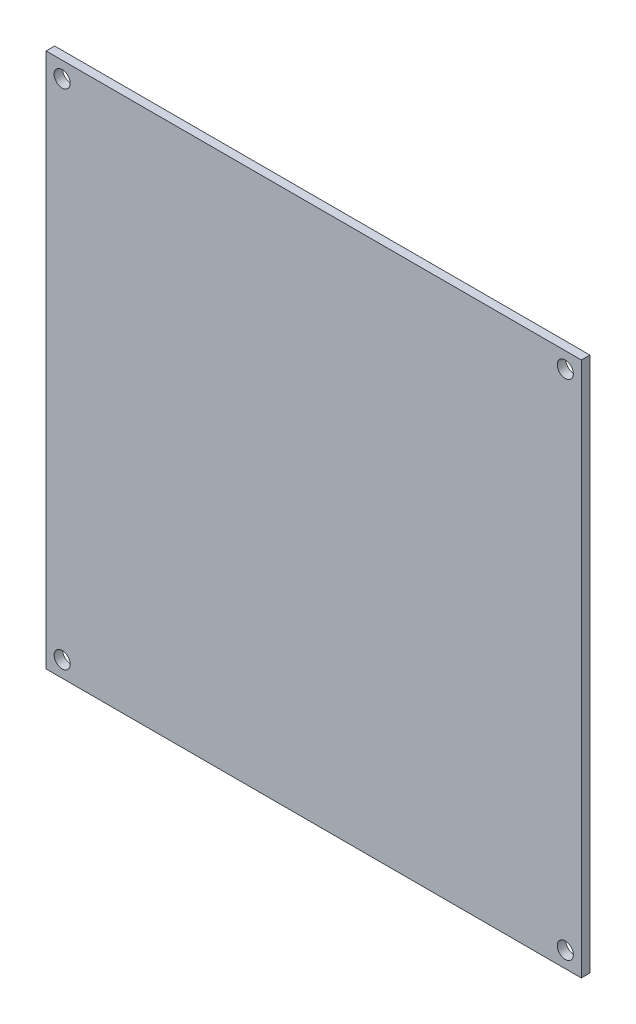
ISO-10303-21;
HEADER;
FILE_DESCRIPTION(('STEP AP214'),'2;1');
FILE_NAME('part.step','',(''),(''),'','','');
FILE_SCHEMA(('AUTOMOTIVE_DESIGN { 1 0 10303 214 1 1 1 1 }'));
ENDSEC;
DATA;
#1=APPLICATION_CONTEXT('core data for automotive mechanical design processes');
#2=APPLICATION_PROTOCOL_DEFINITION('international standard','automotive_design',2000,#1);
#3=PRODUCT_CONTEXT('',#1,'mechanical');
#4=PRODUCT('Part','Part','',(#3));
#5=PRODUCT_RELATED_PRODUCT_CATEGORY('part','',(#4));
#6=PRODUCT_DEFINITION_FORMATION('','',#4);
#7=PRODUCT_DEFINITION_CONTEXT('part definition',#1,'design');
#8=PRODUCT_DEFINITION('design','',#6,#7);
#9=PRODUCT_DEFINITION_SHAPE('','',#8);
#10=(LENGTH_UNIT() NAMED_UNIT(*) SI_UNIT(.MILLI.,.METRE.));
#11=(NAMED_UNIT(*) PLANE_ANGLE_UNIT() SI_UNIT($,.RADIAN.));
#12=(NAMED_UNIT(*) SI_UNIT($,.STERADIAN.) SOLID_ANGLE_UNIT());
#13=UNCERTAINTY_MEASURE_WITH_UNIT(LENGTH_MEASURE(1.E-05),#10,'distance_accuracy_value','');
#14=(GEOMETRIC_REPRESENTATION_CONTEXT(3) GLOBAL_UNCERTAINTY_ASSIGNED_CONTEXT((#13)) GLOBAL_UNIT_ASSIGNED_CONTEXT((#10,
#11,#12)) REPRESENTATION_CONTEXT('',''));
#15=CARTESIAN_POINT('',(0.,0.,0.));
#16=DIRECTION('',(0.,0.,1.));
#17=DIRECTION('',(1.,0.,0.));
#18=AXIS2_PLACEMENT_3D('',#15,#16,#17);
#19=CARTESIAN_POINT('',(0.,0.,1.6));
#20=DIRECTION('',(0.,0.,-1.));
#21=DIRECTION('',(-1.,0.,0.));
#22=AXIS2_PLACEMENT_3D('',#19,#20,#21);
#23=PLANE('',#22);
#24=DIRECTION('',(0.,-1.,0.));
#25=VECTOR('',#24,1.);
#26=CARTESIAN_POINT('',(0.,0.,1.6));
#27=LINE('',#26,#25);
#28=CARTESIAN_POINT('',(0.,100.,1.6));
#29=VERTEX_POINT('',#28);
#30=CARTESIAN_POINT('',(0.,0.,1.6));
#31=VERTEX_POINT('',#30);
#32=EDGE_CURVE('E92',#29,#31,#27,.T.);
#33=ORIENTED_EDGE('',*,*,#32,.T.);
#34=DIRECTION('',(1.,0.,0.));
#35=VECTOR('',#34,1.);
#36=CARTESIAN_POINT('',(0.,0.,1.6));
#37=LINE('',#36,#35);
#38=CARTESIAN_POINT('',(100.,0.,1.6));
#39=VERTEX_POINT('',#38);
#40=EDGE_CURVE('E87',#31,#39,#37,.T.);
#41=ORIENTED_EDGE('',*,*,#40,.T.);
#42=DIRECTION('',(0.,1.,0.));
#43=VECTOR('',#42,1.);
#44=CARTESIAN_POINT('',(100.,0.,1.6));
#45=LINE('',#44,#43);
#46=CARTESIAN_POINT('',(100.,100.,1.6));
#47=VERTEX_POINT('',#46);
#48=EDGE_CURVE('E90',#39,#47,#45,.T.);
#49=ORIENTED_EDGE('',*,*,#48,.T.);
#50=DIRECTION('',(-1.,0.,0.));
#51=VECTOR('',#50,1.);
#52=CARTESIAN_POINT('',(0.,100.,1.6));
#53=LINE('',#52,#51);
#54=EDGE_CURVE('E57',#47,#29,#53,.T.);
#55=ORIENTED_EDGE('',*,*,#54,.T.);
#56=EDGE_LOOP('',(#33,#41,#49,#55));
#57=FACE_BOUND('',#56,.T.);
#58=CARTESIAN_POINT('',(3.,3.,1.6));
#59=DIRECTION('',(0.,0.,1.));
#60=DIRECTION('',(1.,0.,0.));
#61=AXIS2_PLACEMENT_3D('',#58,#59,#60);
#62=CIRCLE('',#61,1.5);
#63=CARTESIAN_POINT('',(4.5,3.,1.6));
#64=VERTEX_POINT('',#63);
#65=EDGE_CURVE('E112',#64,#64,#62,.T.);
#66=ORIENTED_EDGE('',*,*,#65,.F.);
#67=EDGE_LOOP('',(#66));
#68=FACE_BOUND('',#67,.T.);
#69=CARTESIAN_POINT('',(97.,3.,1.6));
#70=DIRECTION('',(0.,0.,1.));
#71=DIRECTION('',(1.,0.,0.));
#72=AXIS2_PLACEMENT_3D('',#69,#70,#71);
#73=CIRCLE('',#72,1.5);
#74=CARTESIAN_POINT('',(98.5,3.,1.6));
#75=VERTEX_POINT('',#74);
#76=EDGE_CURVE('E134',#75,#75,#73,.T.);
#77=ORIENTED_EDGE('',*,*,#76,.F.);
#78=EDGE_LOOP('',(#77));
#79=FACE_BOUND('',#78,.T.);
#80=CARTESIAN_POINT('',(97.,97.,1.6));
#81=DIRECTION('',(0.,0.,1.));
#82=DIRECTION('',(1.,0.,0.));
#83=AXIS2_PLACEMENT_3D('',#80,#81,#82);
#84=CIRCLE('',#83,1.5);
#85=CARTESIAN_POINT('',(98.5,97.,1.6));
#86=VERTEX_POINT('',#85);
#87=EDGE_CURVE('E142',#86,#86,#84,.T.);
#88=ORIENTED_EDGE('',*,*,#87,.F.);
#89=EDGE_LOOP('',(#88));
#90=FACE_BOUND('',#89,.T.);
#91=CARTESIAN_POINT('',(3.,97.,1.6));
#92=DIRECTION('',(0.,0.,1.));
#93=DIRECTION('',(1.,0.,0.));
#94=AXIS2_PLACEMENT_3D('',#91,#92,#93);
#95=CIRCLE('',#94,1.5);
#96=CARTESIAN_POINT('',(4.5,97.,1.6));
#97=VERTEX_POINT('',#96);
#98=EDGE_CURVE('E150',#97,#97,#95,.T.);
#99=ORIENTED_EDGE('',*,*,#98,.F.);
#100=EDGE_LOOP('',(#99));
#101=FACE_BOUND('',#100,.T.);
#102=ADVANCED_FACE('F39',(#57,#68,#79,#90,#101),#23,.F.);
#103=CARTESIAN_POINT('',(0.,0.,0.));
#104=DIRECTION('',(0.,0.,-1.));
#105=DIRECTION('',(-1.,0.,0.));
#106=AXIS2_PLACEMENT_3D('',#103,#104,#105);
#107=PLANE('',#106);
#108=CARTESIAN_POINT('',(97.,97.,0.));
#109=DIRECTION('',(0.,0.,1.));
#110=DIRECTION('',(1.,0.,0.));
#111=AXIS2_PLACEMENT_3D('',#108,#109,#110);
#112=CIRCLE('',#111,1.5);
#113=CARTESIAN_POINT('',(98.5,97.,0.));
#114=VERTEX_POINT('',#113);
#115=EDGE_CURVE('E146',#114,#114,#112,.T.);
#116=ORIENTED_EDGE('',*,*,#115,.T.);
#117=EDGE_LOOP('',(#116));
#118=FACE_BOUND('',#117,.T.);
#119=CARTESIAN_POINT('',(3.,3.,0.));
#120=DIRECTION('',(0.,0.,1.));
#121=DIRECTION('',(1.,0.,0.));
#122=AXIS2_PLACEMENT_3D('',#119,#120,#121);
#123=CIRCLE('',#122,1.5);
#124=CARTESIAN_POINT('',(4.5,3.,0.));
#125=VERTEX_POINT('',#124);
#126=EDGE_CURVE('E130',#125,#125,#123,.T.);
#127=ORIENTED_EDGE('',*,*,#126,.T.);
#128=EDGE_LOOP('',(#127));
#129=FACE_BOUND('',#128,.T.);
#130=DIRECTION('',(0.,-1.,0.));
#131=VECTOR('',#130,1.);
#132=CARTESIAN_POINT('',(0.,0.,0.));
#133=LINE('',#132,#131);
#134=CARTESIAN_POINT('',(0.,100.,0.));
#135=VERTEX_POINT('',#134);
#136=CARTESIAN_POINT('',(0.,0.,0.));
#137=VERTEX_POINT('',#136);
#138=EDGE_CURVE('E108',#135,#137,#133,.T.);
#139=ORIENTED_EDGE('',*,*,#138,.F.);
#140=DIRECTION('',(-1.,0.,0.));
#141=VECTOR('',#140,1.);
#142=CARTESIAN_POINT('',(0.,100.,0.));
#143=LINE('',#142,#141);
#144=CARTESIAN_POINT('',(100.,100.,0.));
#145=VERTEX_POINT('',#144);
#146=EDGE_CURVE('E80',#145,#135,#143,.T.);
#147=ORIENTED_EDGE('',*,*,#146,.F.);
#148=DIRECTION('',(0.,1.,0.));
#149=VECTOR('',#148,1.);
#150=CARTESIAN_POINT('',(100.,0.,0.));
#151=LINE('',#150,#149);
#152=CARTESIAN_POINT('',(100.,0.,0.));
#153=VERTEX_POINT('',#152);
#154=EDGE_CURVE('E74',#153,#145,#151,.T.);
#155=ORIENTED_EDGE('',*,*,#154,.F.);
#156=DIRECTION('',(1.,0.,0.));
#157=VECTOR('',#156,1.);
#158=CARTESIAN_POINT('',(0.,0.,0.));
#159=LINE('',#158,#157);
#160=EDGE_CURVE('E97',#137,#153,#159,.T.);
#161=ORIENTED_EDGE('',*,*,#160,.F.);
#162=EDGE_LOOP('',(#139,#147,#155,#161));
#163=FACE_BOUND('',#162,.T.);
#164=CARTESIAN_POINT('',(97.,3.,0.));
#165=DIRECTION('',(0.,0.,1.));
#166=DIRECTION('',(1.,0.,0.));
#167=AXIS2_PLACEMENT_3D('',#164,#165,#166);
#168=CIRCLE('',#167,1.5);
#169=CARTESIAN_POINT('',(98.5,3.,0.));
#170=VERTEX_POINT('',#169);
#171=EDGE_CURVE('E138',#170,#170,#168,.T.);
#172=ORIENTED_EDGE('',*,*,#171,.T.);
#173=EDGE_LOOP('',(#172));
#174=FACE_BOUND('',#173,.T.);
#175=CARTESIAN_POINT('',(3.,97.,0.));
#176=DIRECTION('',(0.,0.,1.));
#177=DIRECTION('',(1.,0.,0.));
#178=AXIS2_PLACEMENT_3D('',#175,#176,#177);
#179=CIRCLE('',#178,1.5);
#180=CARTESIAN_POINT('',(4.5,97.,0.));
#181=VERTEX_POINT('',#180);
#182=EDGE_CURVE('E154',#181,#181,#179,.T.);
#183=ORIENTED_EDGE('',*,*,#182,.T.);
#184=EDGE_LOOP('',(#183));
#185=FACE_BOUND('',#184,.T.);
#186=ADVANCED_FACE('F125',(#118,#129,#163,#174,#185),#107,.T.);
#187=CARTESIAN_POINT('',(0.,0.,1.6));
#188=DIRECTION('',(1.,0.,0.));
#189=DIRECTION('',(0.,0.,-1.));
#190=AXIS2_PLACEMENT_3D('',#187,#188,#189);
#191=PLANE('',#190);
#192=ORIENTED_EDGE('',*,*,#138,.T.);
#193=DIRECTION('',(0.,0.,-1.));
#194=VECTOR('',#193,1.);
#195=CARTESIAN_POINT('',(0.,0.,1.6));
#196=LINE('',#195,#194);
#197=EDGE_CURVE('E11',#31,#137,#196,.T.);
#198=ORIENTED_EDGE('',*,*,#197,.F.);
#199=ORIENTED_EDGE('',*,*,#32,.F.);
#200=DIRECTION('',(0.,0.,-1.));
#201=VECTOR('',#200,1.);
#202=CARTESIAN_POINT('',(0.,100.,1.6));
#203=LINE('',#202,#201);
#204=EDGE_CURVE('E104',#29,#135,#203,.T.);
#205=ORIENTED_EDGE('',*,*,#204,.T.);
#206=EDGE_LOOP('',(#192,#198,#199,#205));
#207=FACE_BOUND('',#206,.T.);
#208=ADVANCED_FACE('F41',(#207),#191,.F.);
#209=CARTESIAN_POINT('',(0.,0.,1.6));
#210=DIRECTION('',(0.,1.,0.));
#211=DIRECTION('',(0.,0.,1.));
#212=AXIS2_PLACEMENT_3D('',#209,#210,#211);
#213=PLANE('',#212);
#214=ORIENTED_EDGE('',*,*,#160,.T.);
#215=DIRECTION('',(0.,0.,-1.));
#216=VECTOR('',#215,1.);
#217=CARTESIAN_POINT('',(100.,0.,1.6));
#218=LINE('',#217,#216);
#219=EDGE_CURVE('E49',#39,#153,#218,.T.);
#220=ORIENTED_EDGE('',*,*,#219,.F.);
#221=ORIENTED_EDGE('',*,*,#40,.F.);
#222=ORIENTED_EDGE('',*,*,#197,.T.);
#223=EDGE_LOOP('',(#214,#220,#221,#222));
#224=FACE_BOUND('',#223,.T.);
#225=ADVANCED_FACE('F96',(#224),#213,.F.);
#226=CARTESIAN_POINT('',(100.,0.,1.6));
#227=DIRECTION('',(-1.,0.,0.));
#228=DIRECTION('',(0.,0.,1.));
#229=AXIS2_PLACEMENT_3D('',#226,#227,#228);
#230=PLANE('',#229);
#231=ORIENTED_EDGE('',*,*,#154,.T.);
#232=DIRECTION('',(0.,0.,-1.));
#233=VECTOR('',#232,1.);
#234=CARTESIAN_POINT('',(100.,100.,1.6));
#235=LINE('',#234,#233);
#236=EDGE_CURVE('E99',#47,#145,#235,.T.);
#237=ORIENTED_EDGE('',*,*,#236,.F.);
#238=ORIENTED_EDGE('',*,*,#48,.F.);
#239=ORIENTED_EDGE('',*,*,#219,.T.);
#240=EDGE_LOOP('',(#231,#237,#238,#239));
#241=FACE_BOUND('',#240,.T.);
#242=ADVANCED_FACE('F100',(#241),#230,.F.);
#243=CARTESIAN_POINT('',(0.,100.,1.6));
#244=DIRECTION('',(0.,-1.,0.));
#245=DIRECTION('',(0.,0.,-1.));
#246=AXIS2_PLACEMENT_3D('',#243,#244,#245);
#247=PLANE('',#246);
#248=ORIENTED_EDGE('',*,*,#146,.T.);
#249=ORIENTED_EDGE('',*,*,#204,.F.);
#250=ORIENTED_EDGE('',*,*,#54,.F.);
#251=ORIENTED_EDGE('',*,*,#236,.T.);
#252=EDGE_LOOP('',(#248,#249,#250,#251));
#253=FACE_BOUND('',#252,.T.);
#254=ADVANCED_FACE('F122',(#253),#247,.F.);
#255=CARTESIAN_POINT('',(3.,3.,1.6));
#256=DIRECTION('',(0.,0.,-1.));
#257=DIRECTION('',(-1.,0.,0.));
#258=AXIS2_PLACEMENT_3D('',#255,#256,#257);
#259=CYLINDRICAL_SURFACE('',#258,1.5);
#260=ORIENTED_EDGE('',*,*,#65,.T.);
#261=EDGE_LOOP('',(#260));
#262=FACE_BOUND('',#261,.T.);
#263=ORIENTED_EDGE('',*,*,#126,.F.);
#264=EDGE_LOOP('',(#263));
#265=FACE_BOUND('',#264,.T.);
#266=ADVANCED_FACE('F173',(#262,#265),#259,.F.);
#267=CARTESIAN_POINT('',(97.,3.,1.6));
#268=DIRECTION('',(0.,0.,-1.));
#269=DIRECTION('',(-1.,0.,0.));
#270=AXIS2_PLACEMENT_3D('',#267,#268,#269);
#271=CYLINDRICAL_SURFACE('',#270,1.5);
#272=ORIENTED_EDGE('',*,*,#76,.T.);
#273=EDGE_LOOP('',(#272));
#274=FACE_BOUND('',#273,.T.);
#275=ORIENTED_EDGE('',*,*,#171,.F.);
#276=EDGE_LOOP('',(#275));
#277=FACE_BOUND('',#276,.T.);
#278=ADVANCED_FACE('F219',(#274,#277),#271,.F.);
#279=CARTESIAN_POINT('',(97.,97.,1.6));
#280=DIRECTION('',(0.,0.,-1.));
#281=DIRECTION('',(-1.,0.,0.));
#282=AXIS2_PLACEMENT_3D('',#279,#280,#281);
#283=CYLINDRICAL_SURFACE('',#282,1.5);
#284=ORIENTED_EDGE('',*,*,#87,.T.);
#285=EDGE_LOOP('',(#284));
#286=FACE_BOUND('',#285,.T.);
#287=ORIENTED_EDGE('',*,*,#115,.F.);
#288=EDGE_LOOP('',(#287));
#289=FACE_BOUND('',#288,.T.);
#290=ADVANCED_FACE('F227',(#286,#289),#283,.F.);
#291=CARTESIAN_POINT('',(3.,97.,1.6));
#292=DIRECTION('',(0.,0.,-1.));
#293=DIRECTION('',(-1.,0.,0.));
#294=AXIS2_PLACEMENT_3D('',#291,#292,#293);
#295=CYLINDRICAL_SURFACE('',#294,1.5);
#296=ORIENTED_EDGE('',*,*,#98,.T.);
#297=EDGE_LOOP('',(#296));
#298=FACE_BOUND('',#297,.T.);
#299=ORIENTED_EDGE('',*,*,#182,.F.);
#300=EDGE_LOOP('',(#299));
#301=FACE_BOUND('',#300,.T.);
#302=ADVANCED_FACE('F162',(#298,#301),#295,.F.);
#303=CLOSED_SHELL('',(#102,#186,#208,#225,#242,#254,#266,#278,#290,#302));
#304=MANIFOLD_SOLID_BREP('B2',#303);
#305=ADVANCED_BREP_SHAPE_REPRESENTATION('',(#18,#304),#14);
#306=SHAPE_DEFINITION_REPRESENTATION(#9,#305);
ENDSEC;
END-ISO-10303-21;
